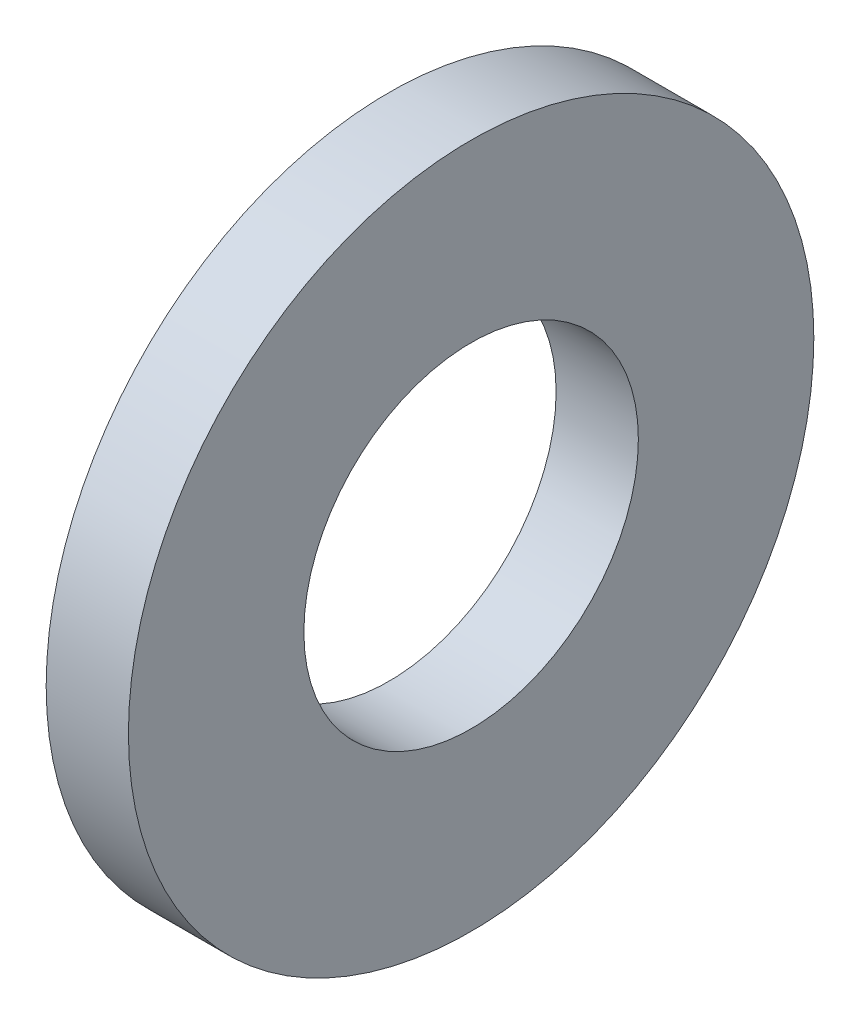
ISO-10303-21;
HEADER;
FILE_DESCRIPTION(('STEP AP214'),'2;1');
FILE_NAME('part.step','',(''),(''),'','','');
FILE_SCHEMA(('AUTOMOTIVE_DESIGN { 1 0 10303 214 1 1 1 1 }'));
ENDSEC;
DATA;
#1=APPLICATION_CONTEXT('core data for automotive mechanical design processes');
#2=APPLICATION_PROTOCOL_DEFINITION('international standard','automotive_design',2000,#1);
#3=PRODUCT_CONTEXT('',#1,'mechanical');
#4=PRODUCT('Part','Part','',(#3));
#5=PRODUCT_RELATED_PRODUCT_CATEGORY('part','',(#4));
#6=PRODUCT_DEFINITION_FORMATION('','',#4);
#7=PRODUCT_DEFINITION_CONTEXT('part definition',#1,'design');
#8=PRODUCT_DEFINITION('design','',#6,#7);
#9=PRODUCT_DEFINITION_SHAPE('','',#8);
#10=(LENGTH_UNIT() NAMED_UNIT(*) SI_UNIT(.MILLI.,.METRE.));
#11=(NAMED_UNIT(*) PLANE_ANGLE_UNIT() SI_UNIT($,.RADIAN.));
#12=(NAMED_UNIT(*) SI_UNIT($,.STERADIAN.) SOLID_ANGLE_UNIT());
#13=UNCERTAINTY_MEASURE_WITH_UNIT(LENGTH_MEASURE(1.E-05),#10,'distance_accuracy_value','');
#14=(GEOMETRIC_REPRESENTATION_CONTEXT(3) GLOBAL_UNCERTAINTY_ASSIGNED_CONTEXT((#13)) GLOBAL_UNIT_ASSIGNED_CONTEXT((#10,
#11,#12)) REPRESENTATION_CONTEXT('',''));
#15=CARTESIAN_POINT('',(0.,0.,0.));
#16=DIRECTION('',(0.,0.,1.));
#17=DIRECTION('',(1.,0.,0.));
#18=AXIS2_PLACEMENT_3D('',#15,#16,#17);
#19=CARTESIAN_POINT('',(-34.9249999999999,0.,0.));
#20=DIRECTION('',(-1.,0.,0.));
#21=DIRECTION('',(0.,0.,1.));
#22=AXIS2_PLACEMENT_3D('',#19,#20,#21);
#23=CYLINDRICAL_SURFACE('',#22,2.44);
#24=CARTESIAN_POINT('',(0.,0.,0.));
#25=DIRECTION('',(-1.,0.,0.));
#26=DIRECTION('',(0.,0.,1.));
#27=AXIS2_PLACEMENT_3D('',#24,#25,#26);
#28=CIRCLE('',#27,2.44);
#29=CARTESIAN_POINT('',(0.,0.,2.44));
#30=VERTEX_POINT('',#29);
#31=EDGE_CURVE('E10',#30,#30,#28,.T.);
#32=ORIENTED_EDGE('',*,*,#31,.F.);
#33=EDGE_LOOP('',(#32));
#34=FACE_BOUND('',#33,.T.);
#35=CARTESIAN_POINT('',(-1.2,0.,0.));
#36=DIRECTION('',(-1.,0.,0.));
#37=DIRECTION('',(0.,0.,1.));
#38=AXIS2_PLACEMENT_3D('',#35,#36,#37);
#39=CIRCLE('',#38,2.44);
#40=CARTESIAN_POINT('',(-1.2,0.,2.44));
#41=VERTEX_POINT('',#40);
#42=EDGE_CURVE('E45',#41,#41,#39,.T.);
#43=ORIENTED_EDGE('',*,*,#42,.T.);
#44=EDGE_LOOP('',(#43));
#45=FACE_BOUND('',#44,.T.);
#46=ADVANCED_FACE('F31',(#34,#45),#23,.F.);
#47=CARTESIAN_POINT('',(0.,2.44,0.));
#48=DIRECTION('',(-1.,0.,0.));
#49=DIRECTION('',(0.,0.,1.));
#50=AXIS2_PLACEMENT_3D('',#47,#48,#49);
#51=PLANE('',#50);
#52=CARTESIAN_POINT('',(0.,0.,0.));
#53=DIRECTION('',(-1.,0.,0.));
#54=DIRECTION('',(0.,0.,1.));
#55=AXIS2_PLACEMENT_3D('',#52,#53,#54);
#56=CIRCLE('',#55,5.);
#57=CARTESIAN_POINT('',(0.,0.,5.));
#58=VERTEX_POINT('',#57);
#59=EDGE_CURVE('E37',#58,#58,#56,.T.);
#60=ORIENTED_EDGE('',*,*,#59,.F.);
#61=EDGE_LOOP('',(#60));
#62=FACE_BOUND('',#61,.T.);
#63=ORIENTED_EDGE('',*,*,#31,.T.);
#64=EDGE_LOOP('',(#63));
#65=FACE_BOUND('',#64,.T.);
#66=ADVANCED_FACE('F60',(#62,#65),#51,.F.);
#67=CARTESIAN_POINT('',(-34.9249999999999,0.,0.));
#68=DIRECTION('',(-1.,0.,0.));
#69=DIRECTION('',(0.,0.,1.));
#70=AXIS2_PLACEMENT_3D('',#67,#68,#69);
#71=CYLINDRICAL_SURFACE('',#70,5.);
#72=CARTESIAN_POINT('',(-1.2,0.,0.));
#73=DIRECTION('',(-1.,0.,0.));
#74=DIRECTION('',(0.,0.,1.));
#75=AXIS2_PLACEMENT_3D('',#72,#73,#74);
#76=CIRCLE('',#75,5.);
#77=CARTESIAN_POINT('',(-1.2,0.,5.));
#78=VERTEX_POINT('',#77);
#79=EDGE_CURVE('E41',#78,#78,#76,.T.);
#80=ORIENTED_EDGE('',*,*,#79,.F.);
#81=EDGE_LOOP('',(#80));
#82=FACE_BOUND('',#81,.T.);
#83=ORIENTED_EDGE('',*,*,#59,.T.);
#84=EDGE_LOOP('',(#83));
#85=FACE_BOUND('',#84,.T.);
#86=ADVANCED_FACE('F55',(#82,#85),#71,.T.);
#87=CARTESIAN_POINT('',(-1.2,5.,0.));
#88=DIRECTION('',(1.,0.,0.));
#89=DIRECTION('',(0.,0.,-1.));
#90=AXIS2_PLACEMENT_3D('',#87,#88,#89);
#91=PLANE('',#90);
#92=ORIENTED_EDGE('',*,*,#42,.F.);
#93=EDGE_LOOP('',(#92));
#94=FACE_BOUND('',#93,.T.);
#95=ORIENTED_EDGE('',*,*,#79,.T.);
#96=EDGE_LOOP('',(#95));
#97=FACE_BOUND('',#96,.T.);
#98=ADVANCED_FACE('F52',(#94,#97),#91,.F.);
#99=CLOSED_SHELL('',(#46,#66,#86,#98));
#100=MANIFOLD_SOLID_BREP('B2',#99);
#101=ADVANCED_BREP_SHAPE_REPRESENTATION('',(#18,#100),#14);
#102=SHAPE_DEFINITION_REPRESENTATION(#9,#101);
ENDSEC;
END-ISO-10303-21;
